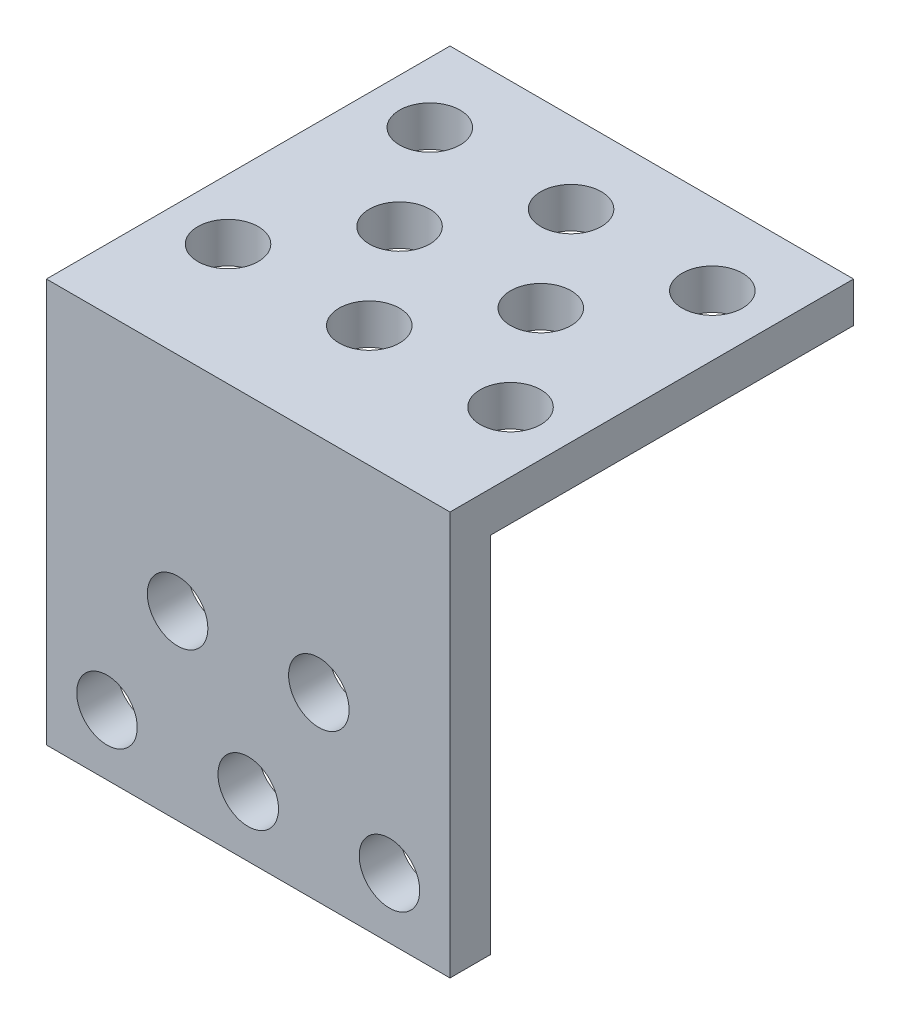
ISO-10303-21;
HEADER;
FILE_DESCRIPTION(('STEP AP214'),'2;1');
FILE_NAME('part.step','',(''),(''),'','','');
FILE_SCHEMA(('AUTOMOTIVE_DESIGN { 1 0 10303 214 1 1 1 1 }'));
ENDSEC;
DATA;
#1=APPLICATION_CONTEXT('core data for automotive mechanical design processes');
#2=APPLICATION_PROTOCOL_DEFINITION('international standard','automotive_design',2000,#1);
#3=PRODUCT_CONTEXT('',#1,'mechanical');
#4=PRODUCT('Part','Part','',(#3));
#5=PRODUCT_RELATED_PRODUCT_CATEGORY('part','',(#4));
#6=PRODUCT_DEFINITION_FORMATION('','',#4);
#7=PRODUCT_DEFINITION_CONTEXT('part definition',#1,'design');
#8=PRODUCT_DEFINITION('design','',#6,#7);
#9=PRODUCT_DEFINITION_SHAPE('','',#8);
#10=(LENGTH_UNIT() NAMED_UNIT(*) SI_UNIT(.MILLI.,.METRE.));
#11=(NAMED_UNIT(*) PLANE_ANGLE_UNIT() SI_UNIT($,.RADIAN.));
#12=(NAMED_UNIT(*) SI_UNIT($,.STERADIAN.) SOLID_ANGLE_UNIT());
#13=UNCERTAINTY_MEASURE_WITH_UNIT(LENGTH_MEASURE(1.E-05),#10,'distance_accuracy_value','');
#14=(GEOMETRIC_REPRESENTATION_CONTEXT(3) GLOBAL_UNCERTAINTY_ASSIGNED_CONTEXT((#13)) GLOBAL_UNIT_ASSIGNED_CONTEXT((#10,
#11,#12)) REPRESENTATION_CONTEXT('',''));
#15=CARTESIAN_POINT('',(0.,0.,0.));
#16=DIRECTION('',(0.,0.,1.));
#17=DIRECTION('',(1.,0.,0.));
#18=AXIS2_PLACEMENT_3D('',#15,#16,#17);
#19=CARTESIAN_POINT('',(20.,0.,-2.));
#20=DIRECTION('',(0.,0.,1.));
#21=DIRECTION('',(1.,0.,0.));
#22=AXIS2_PLACEMENT_3D('',#19,#20,#21);
#23=PLANE('',#22);
#24=DIRECTION('',(1.,0.,0.));
#25=VECTOR('',#24,1.);
#26=CARTESIAN_POINT('',(20.,18.,-2.));
#27=LINE('',#26,#25);
#28=CARTESIAN_POINT('',(20.,18.,-2.));
#29=VERTEX_POINT('',#28);
#30=CARTESIAN_POINT('',(0.,18.,-2.));
#31=VERTEX_POINT('',#30);
#32=EDGE_CURVE('E75',#29,#31,#27,.F.);
#33=ORIENTED_EDGE('',*,*,#32,.F.);
#34=DIRECTION('',(0.,1.,0.));
#35=VECTOR('',#34,1.);
#36=CARTESIAN_POINT('',(20.,0.,-2.));
#37=LINE('',#36,#35);
#38=CARTESIAN_POINT('',(20.,0.,-2.));
#39=VERTEX_POINT('',#38);
#40=EDGE_CURVE('E436',#39,#29,#37,.T.);
#41=ORIENTED_EDGE('',*,*,#40,.F.);
#42=DIRECTION('',(1.,0.,0.));
#43=VECTOR('',#42,1.);
#44=CARTESIAN_POINT('',(20.,0.,-2.));
#45=LINE('',#44,#43);
#46=CARTESIAN_POINT('',(0.,0.,-2.));
#47=VERTEX_POINT('',#46);
#48=EDGE_CURVE('E77',#39,#47,#45,.F.);
#49=ORIENTED_EDGE('',*,*,#48,.T.);
#50=DIRECTION('',(0.,1.,0.));
#51=VECTOR('',#50,1.);
#52=CARTESIAN_POINT('',(0.,0.,-2.));
#53=LINE('',#52,#51);
#54=EDGE_CURVE('E72',#47,#31,#53,.T.);
#55=ORIENTED_EDGE('',*,*,#54,.T.);
#56=EDGE_LOOP('',(#33,#41,#49,#55));
#57=FACE_BOUND('',#56,.T.);
#58=CARTESIAN_POINT('',(3.,3.,-2.));
#59=DIRECTION('',(0.,0.,1.));
#60=DIRECTION('',(1.,0.,0.));
#61=AXIS2_PLACEMENT_3D('',#58,#59,#60);
#62=CIRCLE('',#61,1.5);
#63=CARTESIAN_POINT('',(4.5,3.,-2.));
#64=VERTEX_POINT('',#63);
#65=EDGE_CURVE('E80',#64,#64,#62,.T.);
#66=ORIENTED_EDGE('',*,*,#65,.T.);
#67=EDGE_LOOP('',(#66));
#68=FACE_BOUND('',#67,.T.);
#69=CARTESIAN_POINT('',(6.49999999999998,9.,-2.));
#70=DIRECTION('',(0.,0.,1.));
#71=DIRECTION('',(1.,0.,0.));
#72=AXIS2_PLACEMENT_3D('',#69,#70,#71);
#73=CIRCLE('',#72,1.5);
#74=CARTESIAN_POINT('',(7.99999999999998,9.,-2.));
#75=VERTEX_POINT('',#74);
#76=EDGE_CURVE('E145',#75,#75,#73,.T.);
#77=ORIENTED_EDGE('',*,*,#76,.T.);
#78=EDGE_LOOP('',(#77));
#79=FACE_BOUND('',#78,.T.);
#80=CARTESIAN_POINT('',(13.5,9.,-2.));
#81=DIRECTION('',(0.,0.,1.));
#82=DIRECTION('',(1.,0.,0.));
#83=AXIS2_PLACEMENT_3D('',#80,#81,#82);
#84=CIRCLE('',#83,1.5);
#85=CARTESIAN_POINT('',(15.,9.,-2.));
#86=VERTEX_POINT('',#85);
#87=EDGE_CURVE('E148',#86,#86,#84,.T.);
#88=ORIENTED_EDGE('',*,*,#87,.T.);
#89=EDGE_LOOP('',(#88));
#90=FACE_BOUND('',#89,.T.);
#91=CARTESIAN_POINT('',(17.,3.,-2.));
#92=DIRECTION('',(0.,0.,1.));
#93=DIRECTION('',(1.,0.,0.));
#94=AXIS2_PLACEMENT_3D('',#91,#92,#93);
#95=CIRCLE('',#94,1.5);
#96=CARTESIAN_POINT('',(18.5,3.,-2.));
#97=VERTEX_POINT('',#96);
#98=EDGE_CURVE('E151',#97,#97,#95,.T.);
#99=ORIENTED_EDGE('',*,*,#98,.T.);
#100=EDGE_LOOP('',(#99));
#101=FACE_BOUND('',#100,.T.);
#102=CARTESIAN_POINT('',(10.,3.,-2.));
#103=DIRECTION('',(0.,0.,1.));
#104=DIRECTION('',(1.,0.,0.));
#105=AXIS2_PLACEMENT_3D('',#102,#103,#104);
#106=CIRCLE('',#105,1.5);
#107=CARTESIAN_POINT('',(11.5,3.,-2.));
#108=VERTEX_POINT('',#107);
#109=EDGE_CURVE('E97',#108,#108,#106,.T.);
#110=ORIENTED_EDGE('',*,*,#109,.T.);
#111=EDGE_LOOP('',(#110));
#112=FACE_BOUND('',#111,.T.);
#113=ADVANCED_FACE('F17',(#57,#68,#79,#90,#101,#112),#23,.F.);
#114=CARTESIAN_POINT('',(20.,18.,0.));
#115=DIRECTION('',(0.,-1.,0.));
#116=DIRECTION('',(0.,0.,-1.));
#117=AXIS2_PLACEMENT_3D('',#114,#115,#116);
#118=PLANE('',#117);
#119=DIRECTION('',(0.,0.,-1.));
#120=VECTOR('',#119,1.);
#121=CARTESIAN_POINT('',(20.,18.,0.));
#122=LINE('',#121,#120);
#123=CARTESIAN_POINT('',(20.,18.,-20.));
#124=VERTEX_POINT('',#123);
#125=EDGE_CURVE('E85',#29,#124,#122,.T.);
#126=ORIENTED_EDGE('',*,*,#125,.F.);
#127=ORIENTED_EDGE('',*,*,#32,.T.);
#128=DIRECTION('',(0.,0.,-1.));
#129=VECTOR('',#128,1.);
#130=CARTESIAN_POINT('',(0.,18.,0.));
#131=LINE('',#130,#129);
#132=CARTESIAN_POINT('',(0.,18.,-20.));
#133=VERTEX_POINT('',#132);
#134=EDGE_CURVE('E67',#31,#133,#131,.T.);
#135=ORIENTED_EDGE('',*,*,#134,.T.);
#136=DIRECTION('',(1.,0.,0.));
#137=VECTOR('',#136,1.);
#138=CARTESIAN_POINT('',(20.,18.,-20.));
#139=LINE('',#138,#137);
#140=EDGE_CURVE('E96',#133,#124,#139,.T.);
#141=ORIENTED_EDGE('',*,*,#140,.T.);
#142=EDGE_LOOP('',(#126,#127,#135,#141));
#143=FACE_BOUND('',#142,.T.);
#144=CARTESIAN_POINT('',(3.,18.,-6.));
#145=DIRECTION('',(0.,1.,0.));
#146=DIRECTION('',(0.,0.,1.));
#147=AXIS2_PLACEMENT_3D('',#144,#145,#146);
#148=CIRCLE('',#147,1.5);
#149=CARTESIAN_POINT('',(3.,18.,-4.5));
#150=VERTEX_POINT('',#149);
#151=EDGE_CURVE('E98',#150,#150,#148,.T.);
#152=ORIENTED_EDGE('',*,*,#151,.T.);
#153=EDGE_LOOP('',(#152));
#154=FACE_BOUND('',#153,.T.);
#155=CARTESIAN_POINT('',(10.,18.,-6.));
#156=DIRECTION('',(0.,1.,0.));
#157=DIRECTION('',(0.,0.,1.));
#158=AXIS2_PLACEMENT_3D('',#155,#156,#157);
#159=CIRCLE('',#158,1.5);
#160=CARTESIAN_POINT('',(10.,18.,-4.5));
#161=VERTEX_POINT('',#160);
#162=EDGE_CURVE('E158',#161,#161,#159,.T.);
#163=ORIENTED_EDGE('',*,*,#162,.T.);
#164=EDGE_LOOP('',(#163));
#165=FACE_BOUND('',#164,.T.);
#166=CARTESIAN_POINT('',(17.,18.,-6.));
#167=DIRECTION('',(0.,1.,0.));
#168=DIRECTION('',(0.,0.,1.));
#169=AXIS2_PLACEMENT_3D('',#166,#167,#168);
#170=CIRCLE('',#169,1.5);
#171=CARTESIAN_POINT('',(17.,18.,-4.5));
#172=VERTEX_POINT('',#171);
#173=EDGE_CURVE('E161',#172,#172,#170,.T.);
#174=ORIENTED_EDGE('',*,*,#173,.T.);
#175=EDGE_LOOP('',(#174));
#176=FACE_BOUND('',#175,.T.);
#177=CARTESIAN_POINT('',(13.5,18.,-11.));
#178=DIRECTION('',(0.,1.,0.));
#179=DIRECTION('',(0.,0.,1.));
#180=AXIS2_PLACEMENT_3D('',#177,#178,#179);
#181=CIRCLE('',#180,1.5);
#182=CARTESIAN_POINT('',(13.5,18.,-9.5));
#183=VERTEX_POINT('',#182);
#184=EDGE_CURVE('E164',#183,#183,#181,.T.);
#185=ORIENTED_EDGE('',*,*,#184,.T.);
#186=EDGE_LOOP('',(#185));
#187=FACE_BOUND('',#186,.T.);
#188=CARTESIAN_POINT('',(6.49999999999998,18.,-11.));
#189=DIRECTION('',(0.,1.,0.));
#190=DIRECTION('',(0.,0.,1.));
#191=AXIS2_PLACEMENT_3D('',#188,#189,#190);
#192=CIRCLE('',#191,1.5);
#193=CARTESIAN_POINT('',(6.49999999999998,18.,-9.5));
#194=VERTEX_POINT('',#193);
#195=EDGE_CURVE('E167',#194,#194,#192,.T.);
#196=ORIENTED_EDGE('',*,*,#195,.T.);
#197=EDGE_LOOP('',(#196));
#198=FACE_BOUND('',#197,.T.);
#199=CARTESIAN_POINT('',(2.99999999999996,18.,-16.));
#200=DIRECTION('',(0.,1.,0.));
#201=DIRECTION('',(0.,0.,1.));
#202=AXIS2_PLACEMENT_3D('',#199,#200,#201);
#203=CIRCLE('',#202,1.5);
#204=CARTESIAN_POINT('',(2.99999999999996,18.,-14.5));
#205=VERTEX_POINT('',#204);
#206=EDGE_CURVE('E170',#205,#205,#203,.T.);
#207=ORIENTED_EDGE('',*,*,#206,.T.);
#208=EDGE_LOOP('',(#207));
#209=FACE_BOUND('',#208,.T.);
#210=CARTESIAN_POINT('',(9.99999999999997,18.,-16.));
#211=DIRECTION('',(0.,1.,0.));
#212=DIRECTION('',(0.,0.,1.));
#213=AXIS2_PLACEMENT_3D('',#210,#211,#212);
#214=CIRCLE('',#213,1.49999999999999);
#215=CARTESIAN_POINT('',(9.99999999999997,18.,-14.5));
#216=VERTEX_POINT('',#215);
#217=EDGE_CURVE('E172',#216,#216,#214,.T.);
#218=ORIENTED_EDGE('',*,*,#217,.T.);
#219=EDGE_LOOP('',(#218));
#220=FACE_BOUND('',#219,.T.);
#221=CARTESIAN_POINT('',(17.,18.,-16.));
#222=DIRECTION('',(0.,1.,0.));
#223=DIRECTION('',(0.,0.,1.));
#224=AXIS2_PLACEMENT_3D('',#221,#222,#223);
#225=CIRCLE('',#224,1.5);
#226=CARTESIAN_POINT('',(17.,18.,-14.5));
#227=VERTEX_POINT('',#226);
#228=EDGE_CURVE('E20',#227,#227,#225,.T.);
#229=ORIENTED_EDGE('',*,*,#228,.T.);
#230=EDGE_LOOP('',(#229));
#231=FACE_BOUND('',#230,.T.);
#232=ADVANCED_FACE('F82',(#143,#154,#165,#176,#187,#198,#209,#220,#231),#118,.T.);
#233=CARTESIAN_POINT('',(17.,-0.001000000000001,-16.));
#234=DIRECTION('',(0.,1.,0.));
#235=DIRECTION('',(0.,0.,1.));
#236=AXIS2_PLACEMENT_3D('',#233,#234,#235);
#237=CYLINDRICAL_SURFACE('',#236,1.5);
#238=CARTESIAN_POINT('',(17.,20.,-16.));
#239=DIRECTION('',(0.,1.,0.));
#240=DIRECTION('',(0.,0.,1.));
#241=AXIS2_PLACEMENT_3D('',#238,#239,#240);
#242=CIRCLE('',#241,1.5);
#243=CARTESIAN_POINT('',(17.,20.,-14.5));
#244=VERTEX_POINT('',#243);
#245=EDGE_CURVE('E139',#244,#244,#242,.F.);
#246=ORIENTED_EDGE('',*,*,#245,.F.);
#247=EDGE_LOOP('',(#246));
#248=FACE_BOUND('',#247,.T.);
#249=ORIENTED_EDGE('',*,*,#228,.F.);
#250=EDGE_LOOP('',(#249));
#251=FACE_BOUND('',#250,.T.);
#252=ADVANCED_FACE('F180',(#248,#251),#237,.F.);
#253=CARTESIAN_POINT('',(9.99999999999997,-0.001000000000001,-16.));
#254=DIRECTION('',(0.,1.,0.));
#255=DIRECTION('',(0.,0.,1.));
#256=AXIS2_PLACEMENT_3D('',#253,#254,#255);
#257=CYLINDRICAL_SURFACE('',#256,1.49999999999999);
#258=CARTESIAN_POINT('',(9.99999999999997,20.,-16.));
#259=DIRECTION('',(0.,1.,0.));
#260=DIRECTION('',(0.,0.,1.));
#261=AXIS2_PLACEMENT_3D('',#258,#259,#260);
#262=CIRCLE('',#261,1.49999999999999);
#263=CARTESIAN_POINT('',(9.99999999999997,20.,-14.5));
#264=VERTEX_POINT('',#263);
#265=EDGE_CURVE('E136',#264,#264,#262,.F.);
#266=ORIENTED_EDGE('',*,*,#265,.F.);
#267=EDGE_LOOP('',(#266));
#268=FACE_BOUND('',#267,.T.);
#269=ORIENTED_EDGE('',*,*,#217,.F.);
#270=EDGE_LOOP('',(#269));
#271=FACE_BOUND('',#270,.T.);
#272=ADVANCED_FACE('F182',(#268,#271),#257,.F.);
#273=CARTESIAN_POINT('',(2.99999999999996,-0.001000000000001,-16.));
#274=DIRECTION('',(0.,1.,0.));
#275=DIRECTION('',(0.,0.,1.));
#276=AXIS2_PLACEMENT_3D('',#273,#274,#275);
#277=CYLINDRICAL_SURFACE('',#276,1.5);
#278=CARTESIAN_POINT('',(2.99999999999996,20.,-16.));
#279=DIRECTION('',(0.,1.,0.));
#280=DIRECTION('',(0.,0.,1.));
#281=AXIS2_PLACEMENT_3D('',#278,#279,#280);
#282=CIRCLE('',#281,1.5);
#283=CARTESIAN_POINT('',(2.99999999999996,20.,-14.5));
#284=VERTEX_POINT('',#283);
#285=EDGE_CURVE('E133',#284,#284,#282,.F.);
#286=ORIENTED_EDGE('',*,*,#285,.F.);
#287=EDGE_LOOP('',(#286));
#288=FACE_BOUND('',#287,.T.);
#289=ORIENTED_EDGE('',*,*,#206,.F.);
#290=EDGE_LOOP('',(#289));
#291=FACE_BOUND('',#290,.T.);
#292=ADVANCED_FACE('F190',(#288,#291),#277,.F.);
#293=CARTESIAN_POINT('',(6.49999999999998,-0.001000000000001,-11.));
#294=DIRECTION('',(0.,1.,0.));
#295=DIRECTION('',(0.,0.,1.));
#296=AXIS2_PLACEMENT_3D('',#293,#294,#295);
#297=CYLINDRICAL_SURFACE('',#296,1.5);
#298=CARTESIAN_POINT('',(6.49999999999998,20.,-11.));
#299=DIRECTION('',(0.,1.,0.));
#300=DIRECTION('',(0.,0.,1.));
#301=AXIS2_PLACEMENT_3D('',#298,#299,#300);
#302=CIRCLE('',#301,1.5);
#303=CARTESIAN_POINT('',(6.49999999999998,20.,-9.5));
#304=VERTEX_POINT('',#303);
#305=EDGE_CURVE('E130',#304,#304,#302,.F.);
#306=ORIENTED_EDGE('',*,*,#305,.F.);
#307=EDGE_LOOP('',(#306));
#308=FACE_BOUND('',#307,.T.);
#309=ORIENTED_EDGE('',*,*,#195,.F.);
#310=EDGE_LOOP('',(#309));
#311=FACE_BOUND('',#310,.T.);
#312=ADVANCED_FACE('F255',(#308,#311),#297,.F.);
#313=CARTESIAN_POINT('',(13.5,-0.001000000000001,-11.));
#314=DIRECTION('',(0.,1.,0.));
#315=DIRECTION('',(0.,0.,1.));
#316=AXIS2_PLACEMENT_3D('',#313,#314,#315);
#317=CYLINDRICAL_SURFACE('',#316,1.5);
#318=CARTESIAN_POINT('',(13.5,20.,-11.));
#319=DIRECTION('',(0.,1.,0.));
#320=DIRECTION('',(0.,0.,1.));
#321=AXIS2_PLACEMENT_3D('',#318,#319,#320);
#322=CIRCLE('',#321,1.5);
#323=CARTESIAN_POINT('',(13.5,20.,-9.5));
#324=VERTEX_POINT('',#323);
#325=EDGE_CURVE('E127',#324,#324,#322,.F.);
#326=ORIENTED_EDGE('',*,*,#325,.F.);
#327=EDGE_LOOP('',(#326));
#328=FACE_BOUND('',#327,.T.);
#329=ORIENTED_EDGE('',*,*,#184,.F.);
#330=EDGE_LOOP('',(#329));
#331=FACE_BOUND('',#330,.T.);
#332=ADVANCED_FACE('F251',(#328,#331),#317,.F.);
#333=CARTESIAN_POINT('',(17.,-0.001000000000001,-6.));
#334=DIRECTION('',(0.,1.,0.));
#335=DIRECTION('',(0.,0.,1.));
#336=AXIS2_PLACEMENT_3D('',#333,#334,#335);
#337=CYLINDRICAL_SURFACE('',#336,1.5);
#338=CARTESIAN_POINT('',(17.,20.,-6.));
#339=DIRECTION('',(0.,1.,0.));
#340=DIRECTION('',(0.,0.,1.));
#341=AXIS2_PLACEMENT_3D('',#338,#339,#340);
#342=CIRCLE('',#341,1.5);
#343=CARTESIAN_POINT('',(17.,20.,-4.5));
#344=VERTEX_POINT('',#343);
#345=EDGE_CURVE('E124',#344,#344,#342,.F.);
#346=ORIENTED_EDGE('',*,*,#345,.F.);
#347=EDGE_LOOP('',(#346));
#348=FACE_BOUND('',#347,.T.);
#349=ORIENTED_EDGE('',*,*,#173,.F.);
#350=EDGE_LOOP('',(#349));
#351=FACE_BOUND('',#350,.T.);
#352=ADVANCED_FACE('F247',(#348,#351),#337,.F.);
#353=CARTESIAN_POINT('',(10.,-0.001000000000001,-6.));
#354=DIRECTION('',(0.,1.,0.));
#355=DIRECTION('',(0.,0.,1.));
#356=AXIS2_PLACEMENT_3D('',#353,#354,#355);
#357=CYLINDRICAL_SURFACE('',#356,1.5);
#358=CARTESIAN_POINT('',(10.,20.,-6.));
#359=DIRECTION('',(0.,1.,0.));
#360=DIRECTION('',(0.,0.,1.));
#361=AXIS2_PLACEMENT_3D('',#358,#359,#360);
#362=CIRCLE('',#361,1.5);
#363=CARTESIAN_POINT('',(10.,20.,-4.5));
#364=VERTEX_POINT('',#363);
#365=EDGE_CURVE('E121',#364,#364,#362,.F.);
#366=ORIENTED_EDGE('',*,*,#365,.F.);
#367=EDGE_LOOP('',(#366));
#368=FACE_BOUND('',#367,.T.);
#369=ORIENTED_EDGE('',*,*,#162,.F.);
#370=EDGE_LOOP('',(#369));
#371=FACE_BOUND('',#370,.T.);
#372=ADVANCED_FACE('F243',(#368,#371),#357,.F.);
#373=CARTESIAN_POINT('',(3.,-0.001000000000001,-6.));
#374=DIRECTION('',(0.,1.,0.));
#375=DIRECTION('',(0.,0.,1.));
#376=AXIS2_PLACEMENT_3D('',#373,#374,#375);
#377=CYLINDRICAL_SURFACE('',#376,1.5);
#378=CARTESIAN_POINT('',(3.,20.,-6.));
#379=DIRECTION('',(0.,1.,0.));
#380=DIRECTION('',(0.,0.,1.));
#381=AXIS2_PLACEMENT_3D('',#378,#379,#380);
#382=CIRCLE('',#381,1.5);
#383=CARTESIAN_POINT('',(3.,20.,-4.5));
#384=VERTEX_POINT('',#383);
#385=EDGE_CURVE('E117',#384,#384,#382,.F.);
#386=ORIENTED_EDGE('',*,*,#385,.F.);
#387=EDGE_LOOP('',(#386));
#388=FACE_BOUND('',#387,.T.);
#389=ORIENTED_EDGE('',*,*,#151,.F.);
#390=EDGE_LOOP('',(#389));
#391=FACE_BOUND('',#390,.T.);
#392=ADVANCED_FACE('F239',(#388,#391),#377,.F.);
#393=CARTESIAN_POINT('',(20.,0.,-20.));
#394=DIRECTION('',(0.,0.,1.));
#395=DIRECTION('',(1.,0.,0.));
#396=AXIS2_PLACEMENT_3D('',#393,#394,#395);
#397=PLANE('',#396);
#398=DIRECTION('',(1.,0.,0.));
#399=VECTOR('',#398,1.);
#400=CARTESIAN_POINT('',(20.,20.,-20.));
#401=LINE('',#400,#399);
#402=CARTESIAN_POINT('',(20.,20.,-20.));
#403=VERTEX_POINT('',#402);
#404=CARTESIAN_POINT('',(0.,20.,-20.));
#405=VERTEX_POINT('',#404);
#406=EDGE_CURVE('E116',#403,#405,#401,.F.);
#407=ORIENTED_EDGE('',*,*,#406,.F.);
#408=DIRECTION('',(0.,1.,0.));
#409=VECTOR('',#408,1.);
#410=CARTESIAN_POINT('',(20.,0.,-20.));
#411=LINE('',#410,#409);
#412=EDGE_CURVE('E142',#124,#403,#411,.T.);
#413=ORIENTED_EDGE('',*,*,#412,.F.);
#414=ORIENTED_EDGE('',*,*,#140,.F.);
#415=DIRECTION('',(0.,1.,0.));
#416=VECTOR('',#415,1.);
#417=CARTESIAN_POINT('',(0.,0.,-20.));
#418=LINE('',#417,#416);
#419=EDGE_CURVE('E91',#133,#405,#418,.T.);
#420=ORIENTED_EDGE('',*,*,#419,.T.);
#421=EDGE_LOOP('',(#407,#413,#414,#420));
#422=FACE_BOUND('',#421,.T.);
#423=ADVANCED_FACE('F235',(#422),#397,.F.);
#424=CARTESIAN_POINT('',(10.,3.,-20.));
#425=DIRECTION('',(0.,0.,1.));
#426=DIRECTION('',(1.,0.,0.));
#427=AXIS2_PLACEMENT_3D('',#424,#425,#426);
#428=CYLINDRICAL_SURFACE('',#427,1.5);
#429=CARTESIAN_POINT('',(10.,3.,0.));
#430=DIRECTION('',(0.,0.,1.));
#431=DIRECTION('',(1.,0.,0.));
#432=AXIS2_PLACEMENT_3D('',#429,#430,#431);
#433=CIRCLE('',#432,1.5);
#434=CARTESIAN_POINT('',(11.5,3.,0.));
#435=VERTEX_POINT('',#434);
#436=EDGE_CURVE('E113',#435,#435,#433,.F.);
#437=ORIENTED_EDGE('',*,*,#436,.F.);
#438=EDGE_LOOP('',(#437));
#439=FACE_BOUND('',#438,.T.);
#440=ORIENTED_EDGE('',*,*,#109,.F.);
#441=EDGE_LOOP('',(#440));
#442=FACE_BOUND('',#441,.T.);
#443=ADVANCED_FACE('F231',(#439,#442),#428,.F.);
#444=CARTESIAN_POINT('',(17.,3.,-20.));
#445=DIRECTION('',(0.,0.,1.));
#446=DIRECTION('',(1.,0.,0.));
#447=AXIS2_PLACEMENT_3D('',#444,#445,#446);
#448=CYLINDRICAL_SURFACE('',#447,1.5);
#449=CARTESIAN_POINT('',(17.,3.,0.));
#450=DIRECTION('',(0.,0.,1.));
#451=DIRECTION('',(1.,0.,0.));
#452=AXIS2_PLACEMENT_3D('',#449,#450,#451);
#453=CIRCLE('',#452,1.5);
#454=CARTESIAN_POINT('',(18.5,3.,0.));
#455=VERTEX_POINT('',#454);
#456=EDGE_CURVE('E110',#455,#455,#453,.F.);
#457=ORIENTED_EDGE('',*,*,#456,.F.);
#458=EDGE_LOOP('',(#457));
#459=FACE_BOUND('',#458,.T.);
#460=ORIENTED_EDGE('',*,*,#98,.F.);
#461=EDGE_LOOP('',(#460));
#462=FACE_BOUND('',#461,.T.);
#463=ADVANCED_FACE('F227',(#459,#462),#448,.F.);
#464=CARTESIAN_POINT('',(13.5,9.,-20.));
#465=DIRECTION('',(0.,0.,1.));
#466=DIRECTION('',(1.,0.,0.));
#467=AXIS2_PLACEMENT_3D('',#464,#465,#466);
#468=CYLINDRICAL_SURFACE('',#467,1.5);
#469=CARTESIAN_POINT('',(13.5,9.,0.));
#470=DIRECTION('',(0.,0.,1.));
#471=DIRECTION('',(1.,0.,0.));
#472=AXIS2_PLACEMENT_3D('',#469,#470,#471);
#473=CIRCLE('',#472,1.5);
#474=CARTESIAN_POINT('',(15.,9.,0.));
#475=VERTEX_POINT('',#474);
#476=EDGE_CURVE('E107',#475,#475,#473,.F.);
#477=ORIENTED_EDGE('',*,*,#476,.F.);
#478=EDGE_LOOP('',(#477));
#479=FACE_BOUND('',#478,.T.);
#480=ORIENTED_EDGE('',*,*,#87,.F.);
#481=EDGE_LOOP('',(#480));
#482=FACE_BOUND('',#481,.T.);
#483=ADVANCED_FACE('F223',(#479,#482),#468,.F.);
#484=CARTESIAN_POINT('',(6.49999999999998,9.,-20.));
#485=DIRECTION('',(0.,0.,1.));
#486=DIRECTION('',(1.,0.,0.));
#487=AXIS2_PLACEMENT_3D('',#484,#485,#486);
#488=CYLINDRICAL_SURFACE('',#487,1.5);
#489=CARTESIAN_POINT('',(6.49999999999998,9.,0.));
#490=DIRECTION('',(0.,0.,1.));
#491=DIRECTION('',(1.,0.,0.));
#492=AXIS2_PLACEMENT_3D('',#489,#490,#491);
#493=CIRCLE('',#492,1.5);
#494=CARTESIAN_POINT('',(7.99999999999998,9.,0.));
#495=VERTEX_POINT('',#494);
#496=EDGE_CURVE('E104',#495,#495,#493,.F.);
#497=ORIENTED_EDGE('',*,*,#496,.F.);
#498=EDGE_LOOP('',(#497));
#499=FACE_BOUND('',#498,.T.);
#500=ORIENTED_EDGE('',*,*,#76,.F.);
#501=EDGE_LOOP('',(#500));
#502=FACE_BOUND('',#501,.T.);
#503=ADVANCED_FACE('F219',(#499,#502),#488,.F.);
#504=CARTESIAN_POINT('',(3.,3.,-20.));
#505=DIRECTION('',(0.,0.,1.));
#506=DIRECTION('',(1.,0.,0.));
#507=AXIS2_PLACEMENT_3D('',#504,#505,#506);
#508=CYLINDRICAL_SURFACE('',#507,1.5);
#509=CARTESIAN_POINT('',(3.,3.,0.));
#510=DIRECTION('',(0.,0.,1.));
#511=DIRECTION('',(1.,0.,0.));
#512=AXIS2_PLACEMENT_3D('',#509,#510,#511);
#513=CIRCLE('',#512,1.5);
#514=CARTESIAN_POINT('',(4.5,3.,0.));
#515=VERTEX_POINT('',#514);
#516=EDGE_CURVE('E100',#515,#515,#513,.F.);
#517=ORIENTED_EDGE('',*,*,#516,.F.);
#518=EDGE_LOOP('',(#517));
#519=FACE_BOUND('',#518,.T.);
#520=ORIENTED_EDGE('',*,*,#65,.F.);
#521=EDGE_LOOP('',(#520));
#522=FACE_BOUND('',#521,.T.);
#523=ADVANCED_FACE('F216',(#519,#522),#508,.F.);
#524=CARTESIAN_POINT('',(0.,0.,0.));
#525=DIRECTION('',(1.,0.,0.));
#526=DIRECTION('',(0.,0.,-1.));
#527=AXIS2_PLACEMENT_3D('',#524,#525,#526);
#528=PLANE('',#527);
#529=DIRECTION('',(0.,1.,0.));
#530=VECTOR('',#529,1.);
#531=CARTESIAN_POINT('',(0.,0.,0.));
#532=LINE('',#531,#530);
#533=CARTESIAN_POINT('',(0.,20.,0.));
#534=VERTEX_POINT('',#533);
#535=CARTESIAN_POINT('',(0.,0.,0.));
#536=VERTEX_POINT('',#535);
#537=EDGE_CURVE('E103',#534,#536,#532,.F.);
#538=ORIENTED_EDGE('',*,*,#537,.F.);
#539=DIRECTION('',(0.,0.,1.));
#540=VECTOR('',#539,1.);
#541=CARTESIAN_POINT('',(0.,20.,0.));
#542=LINE('',#541,#540);
#543=EDGE_CURVE('E120',#405,#534,#542,.T.);
#544=ORIENTED_EDGE('',*,*,#543,.F.);
#545=ORIENTED_EDGE('',*,*,#419,.F.);
#546=ORIENTED_EDGE('',*,*,#134,.F.);
#547=ORIENTED_EDGE('',*,*,#54,.F.);
#548=DIRECTION('',(0.,0.,1.));
#549=VECTOR('',#548,1.);
#550=CARTESIAN_POINT('',(0.,0.,0.));
#551=LINE('',#550,#549);
#552=EDGE_CURVE('E441',#47,#536,#551,.T.);
#553=ORIENTED_EDGE('',*,*,#552,.T.);
#554=EDGE_LOOP('',(#538,#544,#545,#546,#547,#553));
#555=FACE_BOUND('',#554,.T.);
#556=ADVANCED_FACE('F89',(#555),#528,.F.);
#557=CARTESIAN_POINT('',(20.,0.,0.));
#558=DIRECTION('',(0.,1.,0.));
#559=DIRECTION('',(0.,0.,1.));
#560=AXIS2_PLACEMENT_3D('',#557,#558,#559);
#561=PLANE('',#560);
#562=ORIENTED_EDGE('',*,*,#48,.F.);
#563=DIRECTION('',(0.,0.,-1.));
#564=VECTOR('',#563,1.);
#565=CARTESIAN_POINT('',(20.,0.,0.));
#566=LINE('',#565,#564);
#567=CARTESIAN_POINT('',(20.,0.,0.));
#568=VERTEX_POINT('',#567);
#569=EDGE_CURVE('E438',#568,#39,#566,.T.);
#570=ORIENTED_EDGE('',*,*,#569,.F.);
#571=DIRECTION('',(1.,0.,0.));
#572=VECTOR('',#571,1.);
#573=CARTESIAN_POINT('',(20.,0.,0.));
#574=LINE('',#573,#572);
#575=EDGE_CURVE('E445',#536,#568,#574,.T.);
#576=ORIENTED_EDGE('',*,*,#575,.F.);
#577=ORIENTED_EDGE('',*,*,#552,.F.);
#578=EDGE_LOOP('',(#562,#570,#576,#577));
#579=FACE_BOUND('',#578,.T.);
#580=ADVANCED_FACE('F210',(#579),#561,.F.);
#581=CARTESIAN_POINT('',(20.,0.,0.));
#582=DIRECTION('',(1.,0.,0.));
#583=DIRECTION('',(0.,0.,-1.));
#584=AXIS2_PLACEMENT_3D('',#581,#582,#583);
#585=PLANE('',#584);
#586=DIRECTION('',(0.,0.,1.));
#587=VECTOR('',#586,1.);
#588=CARTESIAN_POINT('',(20.,20.,0.));
#589=LINE('',#588,#587);
#590=CARTESIAN_POINT('',(20.,20.,0.));
#591=VERTEX_POINT('',#590);
#592=EDGE_CURVE('E35',#591,#403,#589,.F.);
#593=ORIENTED_EDGE('',*,*,#592,.F.);
#594=DIRECTION('',(0.,1.,0.));
#595=VECTOR('',#594,1.);
#596=CARTESIAN_POINT('',(20.,0.,0.));
#597=LINE('',#596,#595);
#598=EDGE_CURVE('E26',#568,#591,#597,.T.);
#599=ORIENTED_EDGE('',*,*,#598,.F.);
#600=ORIENTED_EDGE('',*,*,#569,.T.);
#601=ORIENTED_EDGE('',*,*,#40,.T.);
#602=ORIENTED_EDGE('',*,*,#125,.T.);
#603=ORIENTED_EDGE('',*,*,#412,.T.);
#604=EDGE_LOOP('',(#593,#599,#600,#601,#602,#603));
#605=FACE_BOUND('',#604,.T.);
#606=ADVANCED_FACE('F202',(#605),#585,.T.);
#607=CARTESIAN_POINT('',(20.,20.,0.));
#608=DIRECTION('',(0.,1.,0.));
#609=DIRECTION('',(0.,0.,1.));
#610=AXIS2_PLACEMENT_3D('',#607,#608,#609);
#611=PLANE('',#610);
#612=ORIENTED_EDGE('',*,*,#592,.T.);
#613=ORIENTED_EDGE('',*,*,#406,.T.);
#614=ORIENTED_EDGE('',*,*,#543,.T.);
#615=DIRECTION('',(1.,0.,0.));
#616=VECTOR('',#615,1.);
#617=CARTESIAN_POINT('',(20.,20.,0.));
#618=LINE('',#617,#616);
#619=EDGE_CURVE('E11',#591,#534,#618,.F.);
#620=ORIENTED_EDGE('',*,*,#619,.F.);
#621=EDGE_LOOP('',(#612,#613,#614,#620));
#622=FACE_BOUND('',#621,.T.);
#623=ORIENTED_EDGE('',*,*,#385,.T.);
#624=EDGE_LOOP('',(#623));
#625=FACE_BOUND('',#624,.T.);
#626=ORIENTED_EDGE('',*,*,#365,.T.);
#627=EDGE_LOOP('',(#626));
#628=FACE_BOUND('',#627,.T.);
#629=ORIENTED_EDGE('',*,*,#345,.T.);
#630=EDGE_LOOP('',(#629));
#631=FACE_BOUND('',#630,.T.);
#632=ORIENTED_EDGE('',*,*,#325,.T.);
#633=EDGE_LOOP('',(#632));
#634=FACE_BOUND('',#633,.T.);
#635=ORIENTED_EDGE('',*,*,#305,.T.);
#636=EDGE_LOOP('',(#635));
#637=FACE_BOUND('',#636,.T.);
#638=ORIENTED_EDGE('',*,*,#285,.T.);
#639=EDGE_LOOP('',(#638));
#640=FACE_BOUND('',#639,.T.);
#641=ORIENTED_EDGE('',*,*,#265,.T.);
#642=EDGE_LOOP('',(#641));
#643=FACE_BOUND('',#642,.T.);
#644=ORIENTED_EDGE('',*,*,#245,.T.);
#645=EDGE_LOOP('',(#644));
#646=FACE_BOUND('',#645,.T.);
#647=ADVANCED_FACE('F196',(#622,#625,#628,#631,#634,#637,#640,#643,#646),#611,.T.);
#648=CARTESIAN_POINT('',(20.,0.,0.));
#649=DIRECTION('',(0.,0.,1.));
#650=DIRECTION('',(1.,0.,0.));
#651=AXIS2_PLACEMENT_3D('',#648,#649,#650);
#652=PLANE('',#651);
#653=ORIENTED_EDGE('',*,*,#598,.T.);
#654=ORIENTED_EDGE('',*,*,#619,.T.);
#655=ORIENTED_EDGE('',*,*,#537,.T.);
#656=ORIENTED_EDGE('',*,*,#575,.T.);
#657=EDGE_LOOP('',(#653,#654,#655,#656));
#658=FACE_BOUND('',#657,.T.);
#659=ORIENTED_EDGE('',*,*,#516,.T.);
#660=EDGE_LOOP('',(#659));
#661=FACE_BOUND('',#660,.T.);
#662=ORIENTED_EDGE('',*,*,#496,.T.);
#663=EDGE_LOOP('',(#662));
#664=FACE_BOUND('',#663,.T.);
#665=ORIENTED_EDGE('',*,*,#476,.T.);
#666=EDGE_LOOP('',(#665));
#667=FACE_BOUND('',#666,.T.);
#668=ORIENTED_EDGE('',*,*,#456,.T.);
#669=EDGE_LOOP('',(#668));
#670=FACE_BOUND('',#669,.T.);
#671=ORIENTED_EDGE('',*,*,#436,.T.);
#672=EDGE_LOOP('',(#671));
#673=FACE_BOUND('',#672,.T.);
#674=ADVANCED_FACE('F194',(#658,#661,#664,#667,#670,#673),#652,.T.);
#675=CLOSED_SHELL('',(#113,#232,#252,#272,#292,#312,#332,#352,#372,#392,#423,#443,#463,#483,
#503,#523,#556,#580,#606,#647,#674));
#676=MANIFOLD_SOLID_BREP('B1',#675);
#677=ADVANCED_BREP_SHAPE_REPRESENTATION('',(#18,#676),#14);
#678=SHAPE_DEFINITION_REPRESENTATION(#9,#677);
ENDSEC;
END-ISO-10303-21;
